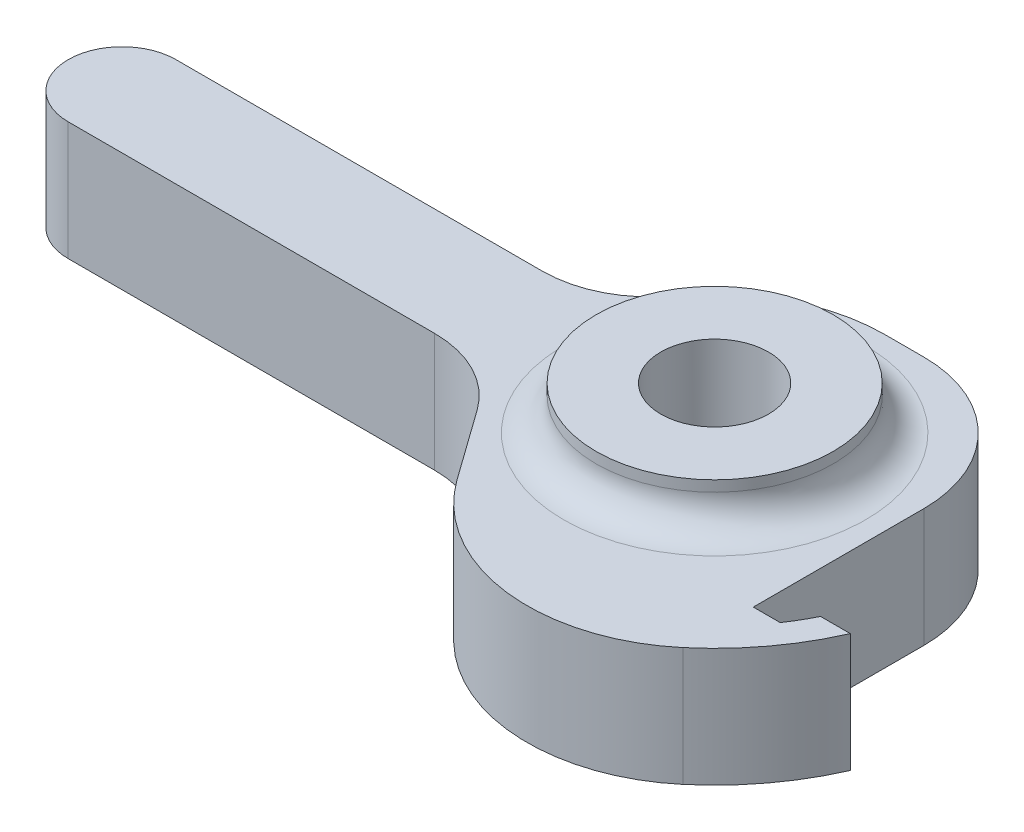
ISO-10303-21;
HEADER;
FILE_DESCRIPTION(('STEP AP214'),'2;1');
FILE_NAME('part.step','',(''),(''),'','','');
FILE_SCHEMA(('AUTOMOTIVE_DESIGN { 1 0 10303 214 1 1 1 1 }'));
ENDSEC;
DATA;
#1=APPLICATION_CONTEXT('core data for automotive mechanical design processes');
#2=APPLICATION_PROTOCOL_DEFINITION('international standard','automotive_design',2000,#1);
#3=PRODUCT_CONTEXT('',#1,'mechanical');
#4=PRODUCT('Part','Part','',(#3));
#5=PRODUCT_RELATED_PRODUCT_CATEGORY('part','',(#4));
#6=PRODUCT_DEFINITION_FORMATION('','',#4);
#7=PRODUCT_DEFINITION_CONTEXT('part definition',#1,'design');
#8=PRODUCT_DEFINITION('design','',#6,#7);
#9=PRODUCT_DEFINITION_SHAPE('','',#8);
#10=(LENGTH_UNIT() NAMED_UNIT(*) SI_UNIT(.MILLI.,.METRE.));
#11=(NAMED_UNIT(*) PLANE_ANGLE_UNIT() SI_UNIT($,.RADIAN.));
#12=(NAMED_UNIT(*) SI_UNIT($,.STERADIAN.) SOLID_ANGLE_UNIT());
#13=UNCERTAINTY_MEASURE_WITH_UNIT(LENGTH_MEASURE(1.E-05),#10,'distance_accuracy_value','');
#14=(GEOMETRIC_REPRESENTATION_CONTEXT(3) GLOBAL_UNCERTAINTY_ASSIGNED_CONTEXT((#13)) GLOBAL_UNIT_ASSIGNED_CONTEXT((#10,
#11,#12)) REPRESENTATION_CONTEXT('',''));
#15=CARTESIAN_POINT('',(0.,0.,0.));
#16=DIRECTION('',(0.,0.,1.));
#17=DIRECTION('',(1.,0.,0.));
#18=AXIS2_PLACEMENT_3D('',#15,#16,#17);
#19=CARTESIAN_POINT('',(82.2518772395423,-78.7336218450221,-13.8106601717798));
#20=DIRECTION('',(0.,1.,0.));
#21=DIRECTION('',(0.,0.,1.));
#22=AXIS2_PLACEMENT_3D('',#19,#20,#21);
#23=PLANE('',#22);
#24=CARTESIAN_POINT('',(80.4412170677624,-78.7336218450221,-12.));
#25=DIRECTION('',(0.,1.,0.));
#26=DIRECTION('',(0.,0.,1.));
#27=AXIS2_PLACEMENT_3D('',#24,#25,#26);
#28=CIRCLE('',#27,6.99999999999999);
#29=CARTESIAN_POINT('',(80.4412170677624,-78.7336218450221,-5.00000000000001));
#30=VERTEX_POINT('',#29);
#31=EDGE_CURVE('E12',#30,#30,#28,.F.);
#32=ORIENTED_EDGE('',*,*,#31,.T.);
#33=EDGE_LOOP('',(#32));
#34=FACE_BOUND('',#33,.T.);
#35=DIRECTION('',(-1.,0.,0.));
#36=VECTOR('',#35,1.);
#37=CARTESIAN_POINT('',(89.5912151460213,-78.7336218450221,-5.89446684));
#38=LINE('',#37,#36);
#39=CARTESIAN_POINT('',(89.5912151460213,-78.7336218450221,-5.89446684));
#40=VERTEX_POINT('',#39);
#41=CARTESIAN_POINT('',(88.3412170677624,-78.7336218450221,-5.89446684));
#42=VERTEX_POINT('',#41);
#43=EDGE_CURVE('E243',#40,#42,#38,.T.);
#44=ORIENTED_EDGE('',*,*,#43,.T.);
#45=DIRECTION('',(0.,0.,-1.));
#46=VECTOR('',#45,1.);
#47=CARTESIAN_POINT('',(88.3412170677624,-78.7336218450221,-13.8106601717798));
#48=LINE('',#47,#46);
#49=CARTESIAN_POINT('',(88.3412170677624,-78.7336218450221,-13.8106601717798));
#50=VERTEX_POINT('',#49);
#51=EDGE_CURVE('E117',#42,#50,#48,.T.);
#52=ORIENTED_EDGE('',*,*,#51,.T.);
#53=CARTESIAN_POINT('',(82.2518772395423,-78.7336218450221,-13.8106601717798));
#54=DIRECTION('',(0.,1.,0.));
#55=DIRECTION('',(0.,0.,1.));
#56=AXIS2_PLACEMENT_3D('',#53,#54,#55);
#57=CIRCLE('',#56,6.08933982822017);
#58=CARTESIAN_POINT('',(82.2518772395423,-78.7336218450221,-19.9));
#59=VERTEX_POINT('',#58);
#60=EDGE_CURVE('E194',#50,#59,#57,.T.);
#61=ORIENTED_EDGE('',*,*,#60,.T.);
#62=DIRECTION('',(-1.,0.,0.));
#63=VECTOR('',#62,1.);
#64=CARTESIAN_POINT('',(82.2518772395423,-78.7336218450221,-19.9));
#65=LINE('',#64,#63);
#66=CARTESIAN_POINT('',(80.4412170677624,-78.7336218450221,-19.9));
#67=VERTEX_POINT('',#66);
#68=EDGE_CURVE('E199',#59,#67,#65,.T.);
#69=ORIENTED_EDGE('',*,*,#68,.T.);
#70=CARTESIAN_POINT('',(80.4412170677624,-78.7336218450221,-12.));
#71=DIRECTION('',(0.,1.,0.));
#72=DIRECTION('',(0.,0.,1.));
#73=AXIS2_PLACEMENT_3D('',#70,#71,#72);
#74=CIRCLE('',#73,7.9);
#75=CARTESIAN_POINT('',(74.0136096301888,-78.7336218450221,-16.593023255814));
#76=VERTEX_POINT('',#75);
#77=EDGE_CURVE('E203',#67,#76,#74,.T.);
#78=ORIENTED_EDGE('',*,*,#77,.T.);
#79=CARTESIAN_POINT('',(69.9455036570409,-78.7336218450221,-19.5));
#80=DIRECTION('',(0.,-1.,0.));
#81=DIRECTION('',(0.,0.,1.));
#82=AXIS2_PLACEMENT_3D('',#79,#80,#81);
#83=CIRCLE('',#82,5.);
#84=CARTESIAN_POINT('',(69.9455036570409,-78.7336218450221,-14.5));
#85=VERTEX_POINT('',#84);
#86=EDGE_CURVE('E207',#76,#85,#83,.T.);
#87=ORIENTED_EDGE('',*,*,#86,.T.);
#88=DIRECTION('',(-1.,0.,0.));
#89=VECTOR('',#88,1.);
#90=CARTESIAN_POINT('',(52.9412170677625,-78.7336218450221,-14.5));
#91=LINE('',#90,#89);
#92=CARTESIAN_POINT('',(52.9412170677625,-78.7336218450221,-14.5));
#93=VERTEX_POINT('',#92);
#94=EDGE_CURVE('E211',#85,#93,#91,.T.);
#95=ORIENTED_EDGE('',*,*,#94,.T.);
#96=CARTESIAN_POINT('',(52.9412170677625,-78.7336218450221,-12.));
#97=DIRECTION('',(0.,1.,0.));
#98=DIRECTION('',(0.,0.,1.));
#99=AXIS2_PLACEMENT_3D('',#96,#97,#98);
#100=CIRCLE('',#99,2.5);
#101=CARTESIAN_POINT('',(52.9412170677625,-78.7336218450221,-9.5));
#102=VERTEX_POINT('',#101);
#103=EDGE_CURVE('E215',#93,#102,#100,.T.);
#104=ORIENTED_EDGE('',*,*,#103,.T.);
#105=DIRECTION('',(1.,0.,0.));
#106=VECTOR('',#105,1.);
#107=CARTESIAN_POINT('',(52.9412170677625,-78.7336218450221,-9.5));
#108=LINE('',#107,#106);
#109=CARTESIAN_POINT('',(69.9455036570409,-78.7336218450221,-9.5));
#110=VERTEX_POINT('',#109);
#111=EDGE_CURVE('E219',#102,#110,#108,.T.);
#112=ORIENTED_EDGE('',*,*,#111,.T.);
#113=CARTESIAN_POINT('',(69.9455036570409,-78.7336218450221,-4.5));
#114=DIRECTION('',(0.,-1.,0.));
#115=DIRECTION('',(0.,0.,-1.));
#116=AXIS2_PLACEMENT_3D('',#113,#114,#115);
#117=CIRCLE('',#116,5.);
#118=CARTESIAN_POINT('',(74.0136096301888,-78.7336218450221,-7.40697674418605));
#119=VERTEX_POINT('',#118);
#120=EDGE_CURVE('E223',#110,#119,#117,.T.);
#121=ORIENTED_EDGE('',*,*,#120,.T.);
#122=DIRECTION('',(0.581395348837209,0.,0.813621194629577));
#123=VECTOR('',#122,1.);
#124=CARTESIAN_POINT('',(74.0136096301888,-78.7336218450221,-7.40697674418604));
#125=LINE('',#124,#123);
#126=CARTESIAN_POINT('',(76.3469888080829,-78.7336218450221,-4.14157952688972));
#127=VERTEX_POINT('',#126);
#128=EDGE_CURVE('E227',#119,#127,#125,.T.);
#129=ORIENTED_EDGE('',*,*,#128,.T.);
#130=CARTESIAN_POINT('',(83.0378562538661,-78.7336218450221,-8.92272244492256));
#131=DIRECTION('',(0.,1.,0.));
#132=DIRECTION('',(0.,0.,-1.));
#133=AXIS2_PLACEMENT_3D('',#130,#131,#132);
#134=CIRCLE('',#133,8.22356581901648);
#135=CARTESIAN_POINT('',(88.3412170677624,-78.7336218450221,-2.63770861380611));
#136=VERTEX_POINT('',#135);
#137=EDGE_CURVE('E231',#127,#136,#134,.T.);
#138=ORIENTED_EDGE('',*,*,#137,.T.);
#139=CARTESIAN_POINT('',(80.4412170677624,-78.7336218450221,-12.));
#140=DIRECTION('',(0.,1.,0.));
#141=DIRECTION('',(0.,0.,-1.));
#142=AXIS2_PLACEMENT_3D('',#139,#140,#141);
#143=CIRCLE('',#142,12.25);
#144=CARTESIAN_POINT('',(91.6588423673576,-78.7336218450221,-7.07786808));
#145=VERTEX_POINT('',#144);
#146=EDGE_CURVE('E235',#136,#145,#143,.T.);
#147=ORIENTED_EDGE('',*,*,#146,.T.);
#148=DIRECTION('',(-1.,0.,0.));
#149=VECTOR('',#148,1.);
#150=CARTESIAN_POINT('',(91.6588423673576,-78.7336218450221,-7.07786808));
#151=LINE('',#150,#149);
#152=CARTESIAN_POINT('',(90.2785244921605,-78.7336218450221,-7.07786808));
#153=VERTEX_POINT('',#152);
#154=EDGE_CURVE('E239',#145,#153,#151,.T.);
#155=ORIENTED_EDGE('',*,*,#154,.T.);
#156=CARTESIAN_POINT('',(80.4412170677624,-78.7336218450221,-12.));
#157=DIRECTION('',(0.,-1.,0.));
#158=DIRECTION('',(0.,0.,-1.));
#159=AXIS2_PLACEMENT_3D('',#156,#157,#158);
#160=CIRCLE('',#159,11.);
#161=EDGE_CURVE('E160',#153,#40,#160,.T.);
#162=ORIENTED_EDGE('',*,*,#161,.T.);
#163=EDGE_LOOP('',(#44,#52,#61,#69,#78,#87,#95,#104,#112,#121,#129,#138,#147,#155,#162));
#164=FACE_BOUND('',#163,.T.);
#165=ADVANCED_FACE('F45',(#34,#164),#23,.T.);
#166=CARTESIAN_POINT('',(89.5912151460213,-84.2336218450221,-5.89446684));
#167=DIRECTION('',(0.,0.,-1.));
#168=DIRECTION('',(-1.,0.,0.));
#169=AXIS2_PLACEMENT_3D('',#166,#167,#168);
#170=PLANE('',#169);
#171=ORIENTED_EDGE('',*,*,#43,.F.);
#172=DIRECTION('',(0.,1.,0.));
#173=VECTOR('',#172,1.);
#174=CARTESIAN_POINT('',(89.5912151460213,-84.2336218450221,-5.89446684));
#175=LINE('',#174,#173);
#176=CARTESIAN_POINT('',(89.5912151460213,-84.2336218450221,-5.89446684));
#177=VERTEX_POINT('',#176);
#178=EDGE_CURVE('E113',#177,#40,#175,.T.);
#179=ORIENTED_EDGE('',*,*,#178,.F.);
#180=DIRECTION('',(-1.,0.,0.));
#181=VECTOR('',#180,1.);
#182=CARTESIAN_POINT('',(89.5912151460213,-84.2336218450221,-5.89446684));
#183=LINE('',#182,#181);
#184=CARTESIAN_POINT('',(88.3412170677624,-84.2336218450221,-5.89446684));
#185=VERTEX_POINT('',#184);
#186=EDGE_CURVE('E175',#177,#185,#183,.T.);
#187=ORIENTED_EDGE('',*,*,#186,.T.);
#188=DIRECTION('',(0.,1.,0.));
#189=VECTOR('',#188,1.);
#190=CARTESIAN_POINT('',(88.3412170677624,-84.2336218450221,-5.89446684));
#191=LINE('',#190,#189);
#192=EDGE_CURVE('E63',#185,#42,#191,.T.);
#193=ORIENTED_EDGE('',*,*,#192,.T.);
#194=EDGE_LOOP('',(#171,#179,#187,#193));
#195=FACE_BOUND('',#194,.T.);
#196=ADVANCED_FACE('F303',(#195),#170,.T.);
#197=CARTESIAN_POINT('',(80.4412170677624,-84.2336218450221,-12.));
#198=DIRECTION('',(0.,1.,0.));
#199=DIRECTION('',(0.,0.,1.));
#200=AXIS2_PLACEMENT_3D('',#197,#198,#199);
#201=CYLINDRICAL_SURFACE('',#200,11.);
#202=ORIENTED_EDGE('',*,*,#161,.F.);
#203=DIRECTION('',(0.,1.,0.));
#204=VECTOR('',#203,1.);
#205=CARTESIAN_POINT('',(90.2785244921605,-84.2336218450221,-7.07786808));
#206=LINE('',#205,#204);
#207=CARTESIAN_POINT('',(90.2785244921605,-84.2336218450221,-7.07786808));
#208=VERTEX_POINT('',#207);
#209=EDGE_CURVE('E155',#208,#153,#206,.T.);
#210=ORIENTED_EDGE('',*,*,#209,.F.);
#211=CARTESIAN_POINT('',(80.4412170677624,-84.2336218450221,-12.));
#212=DIRECTION('',(0.,-1.,0.));
#213=DIRECTION('',(0.,0.,-1.));
#214=AXIS2_PLACEMENT_3D('',#211,#212,#213);
#215=CIRCLE('',#214,11.);
#216=EDGE_CURVE('E158',#208,#177,#215,.T.);
#217=ORIENTED_EDGE('',*,*,#216,.T.);
#218=ORIENTED_EDGE('',*,*,#178,.T.);
#219=EDGE_LOOP('',(#202,#210,#217,#218));
#220=FACE_BOUND('',#219,.T.);
#221=ADVANCED_FACE('F157',(#220),#201,.F.);
#222=CARTESIAN_POINT('',(91.6588423673576,-84.2336218450221,-7.07786808));
#223=DIRECTION('',(0.,0.,-1.));
#224=DIRECTION('',(-1.,0.,0.));
#225=AXIS2_PLACEMENT_3D('',#222,#223,#224);
#226=PLANE('',#225);
#227=ORIENTED_EDGE('',*,*,#154,.F.);
#228=DIRECTION('',(0.,1.,0.));
#229=VECTOR('',#228,1.);
#230=CARTESIAN_POINT('',(91.6588423673576,-84.2336218450221,-7.07786808));
#231=LINE('',#230,#229);
#232=CARTESIAN_POINT('',(91.6588423673576,-84.2336218450221,-7.07786808));
#233=VERTEX_POINT('',#232);
#234=EDGE_CURVE('E166',#233,#145,#231,.T.);
#235=ORIENTED_EDGE('',*,*,#234,.F.);
#236=DIRECTION('',(-1.,0.,0.));
#237=VECTOR('',#236,1.);
#238=CARTESIAN_POINT('',(91.6588423673576,-84.2336218450221,-7.07786808));
#239=LINE('',#238,#237);
#240=EDGE_CURVE('E172',#233,#208,#239,.T.);
#241=ORIENTED_EDGE('',*,*,#240,.T.);
#242=ORIENTED_EDGE('',*,*,#209,.T.);
#243=EDGE_LOOP('',(#227,#235,#241,#242));
#244=FACE_BOUND('',#243,.T.);
#245=ADVANCED_FACE('F178',(#244),#226,.T.);
#246=CARTESIAN_POINT('',(80.4412170677624,-84.2336218450221,-12.));
#247=DIRECTION('',(0.,1.,0.));
#248=DIRECTION('',(0.,0.,1.));
#249=AXIS2_PLACEMENT_3D('',#246,#247,#248);
#250=CYLINDRICAL_SURFACE('',#249,12.25);
#251=ORIENTED_EDGE('',*,*,#146,.F.);
#252=DIRECTION('',(0.,1.,0.));
#253=VECTOR('',#252,1.);
#254=CARTESIAN_POINT('',(88.3412170677624,-84.2336218450221,-2.63770861380611));
#255=LINE('',#254,#253);
#256=CARTESIAN_POINT('',(88.3412170677624,-84.2336218450221,-2.63770861380611));
#257=VERTEX_POINT('',#256);
#258=EDGE_CURVE('E253',#257,#136,#255,.T.);
#259=ORIENTED_EDGE('',*,*,#258,.F.);
#260=CARTESIAN_POINT('',(80.4412170677624,-84.2336218450221,-12.));
#261=DIRECTION('',(0.,1.,0.));
#262=DIRECTION('',(0.,0.,-1.));
#263=AXIS2_PLACEMENT_3D('',#260,#261,#262);
#264=CIRCLE('',#263,12.25);
#265=EDGE_CURVE('E180',#257,#233,#264,.T.);
#266=ORIENTED_EDGE('',*,*,#265,.T.);
#267=ORIENTED_EDGE('',*,*,#234,.T.);
#268=EDGE_LOOP('',(#251,#259,#266,#267));
#269=FACE_BOUND('',#268,.T.);
#270=ADVANCED_FACE('F319',(#269),#250,.T.);
#271=CARTESIAN_POINT('',(83.0378562538661,-84.2336218450221,-8.92272244492256));
#272=DIRECTION('',(0.,1.,0.));
#273=DIRECTION('',(0.,0.,1.));
#274=AXIS2_PLACEMENT_3D('',#271,#272,#273);
#275=CYLINDRICAL_SURFACE('',#274,8.22356581901648);
#276=ORIENTED_EDGE('',*,*,#137,.F.);
#277=DIRECTION('',(0.,1.,0.));
#278=VECTOR('',#277,1.);
#279=CARTESIAN_POINT('',(76.3469888080829,-84.2336218450221,-4.14157952688972));
#280=LINE('',#279,#278);
#281=CARTESIAN_POINT('',(76.3469888080829,-84.2336218450221,-4.14157952688972));
#282=VERTEX_POINT('',#281);
#283=EDGE_CURVE('E256',#282,#127,#280,.T.);
#284=ORIENTED_EDGE('',*,*,#283,.F.);
#285=CARTESIAN_POINT('',(83.0378562538661,-84.2336218450221,-8.92272244492256));
#286=DIRECTION('',(0.,1.,0.));
#287=DIRECTION('',(0.,0.,-1.));
#288=AXIS2_PLACEMENT_3D('',#285,#286,#287);
#289=CIRCLE('',#288,8.22356581901648);
#290=EDGE_CURVE('E185',#282,#257,#289,.T.);
#291=ORIENTED_EDGE('',*,*,#290,.T.);
#292=ORIENTED_EDGE('',*,*,#258,.T.);
#293=EDGE_LOOP('',(#276,#284,#291,#292));
#294=FACE_BOUND('',#293,.T.);
#295=ADVANCED_FACE('F322',(#294),#275,.T.);
#296=CARTESIAN_POINT('',(74.0136096301888,-84.2336218450221,-7.40697674418604));
#297=DIRECTION('',(-0.813621194629577,0.,0.581395348837209));
#298=DIRECTION('',(0.581395348837209,0.,0.813621194629577));
#299=AXIS2_PLACEMENT_3D('',#296,#297,#298);
#300=PLANE('',#299);
#301=ORIENTED_EDGE('',*,*,#128,.F.);
#302=DIRECTION('',(0.,1.,0.));
#303=VECTOR('',#302,1.);
#304=CARTESIAN_POINT('',(74.0136096301888,-84.2336218450221,-7.40697674418605));
#305=LINE('',#304,#303);
#306=CARTESIAN_POINT('',(74.0136096301888,-84.2336218450221,-7.40697674418605));
#307=VERTEX_POINT('',#306);
#308=EDGE_CURVE('E259',#307,#119,#305,.T.);
#309=ORIENTED_EDGE('',*,*,#308,.F.);
#310=DIRECTION('',(0.581395348837209,0.,0.813621194629577));
#311=VECTOR('',#310,1.);
#312=CARTESIAN_POINT('',(74.0136096301888,-84.2336218450221,-7.40697674418604));
#313=LINE('',#312,#311);
#314=EDGE_CURVE('E417',#307,#282,#313,.T.);
#315=ORIENTED_EDGE('',*,*,#314,.T.);
#316=ORIENTED_EDGE('',*,*,#283,.T.);
#317=EDGE_LOOP('',(#301,#309,#315,#316));
#318=FACE_BOUND('',#317,.T.);
#319=ADVANCED_FACE('F326',(#318),#300,.T.);
#320=CARTESIAN_POINT('',(69.9455036570409,-84.2336218450221,-4.5));
#321=DIRECTION('',(0.,1.,0.));
#322=DIRECTION('',(0.,0.,1.));
#323=AXIS2_PLACEMENT_3D('',#320,#321,#322);
#324=CYLINDRICAL_SURFACE('',#323,5.);
#325=ORIENTED_EDGE('',*,*,#120,.F.);
#326=DIRECTION('',(0.,1.,0.));
#327=VECTOR('',#326,1.);
#328=CARTESIAN_POINT('',(69.9455036570409,-84.2336218450221,-9.5));
#329=LINE('',#328,#327);
#330=CARTESIAN_POINT('',(69.9455036570409,-84.2336218450221,-9.5));
#331=VERTEX_POINT('',#330);
#332=EDGE_CURVE('E262',#331,#110,#329,.T.);
#333=ORIENTED_EDGE('',*,*,#332,.F.);
#334=CARTESIAN_POINT('',(69.9455036570409,-84.2336218450221,-4.5));
#335=DIRECTION('',(0.,-1.,0.));
#336=DIRECTION('',(0.,0.,-1.));
#337=AXIS2_PLACEMENT_3D('',#334,#335,#336);
#338=CIRCLE('',#337,5.);
#339=EDGE_CURVE('E413',#331,#307,#338,.T.);
#340=ORIENTED_EDGE('',*,*,#339,.T.);
#341=ORIENTED_EDGE('',*,*,#308,.T.);
#342=EDGE_LOOP('',(#325,#333,#340,#341));
#343=FACE_BOUND('',#342,.T.);
#344=ADVANCED_FACE('F330',(#343),#324,.F.);
#345=CARTESIAN_POINT('',(52.9412170677625,-84.2336218450221,-9.5));
#346=DIRECTION('',(0.,0.,1.));
#347=DIRECTION('',(1.,0.,0.));
#348=AXIS2_PLACEMENT_3D('',#345,#346,#347);
#349=PLANE('',#348);
#350=ORIENTED_EDGE('',*,*,#111,.F.);
#351=DIRECTION('',(0.,1.,0.));
#352=VECTOR('',#351,1.);
#353=CARTESIAN_POINT('',(52.9412170677625,-84.2336218450221,-9.5));
#354=LINE('',#353,#352);
#355=CARTESIAN_POINT('',(52.9412170677625,-84.2336218450221,-9.5));
#356=VERTEX_POINT('',#355);
#357=EDGE_CURVE('E265',#356,#102,#354,.T.);
#358=ORIENTED_EDGE('',*,*,#357,.F.);
#359=DIRECTION('',(1.,0.,0.));
#360=VECTOR('',#359,1.);
#361=CARTESIAN_POINT('',(52.9412170677625,-84.2336218450221,-9.5));
#362=LINE('',#361,#360);
#363=EDGE_CURVE('E409',#356,#331,#362,.T.);
#364=ORIENTED_EDGE('',*,*,#363,.T.);
#365=ORIENTED_EDGE('',*,*,#332,.T.);
#366=EDGE_LOOP('',(#350,#358,#364,#365));
#367=FACE_BOUND('',#366,.T.);
#368=ADVANCED_FACE('F334',(#367),#349,.T.);
#369=CARTESIAN_POINT('',(52.9412170677625,-84.2336218450221,-12.));
#370=DIRECTION('',(0.,1.,0.));
#371=DIRECTION('',(0.,0.,1.));
#372=AXIS2_PLACEMENT_3D('',#369,#370,#371);
#373=CYLINDRICAL_SURFACE('',#372,2.5);
#374=ORIENTED_EDGE('',*,*,#103,.F.);
#375=DIRECTION('',(0.,1.,0.));
#376=VECTOR('',#375,1.);
#377=CARTESIAN_POINT('',(52.9412170677625,-84.2336218450221,-14.5));
#378=LINE('',#377,#376);
#379=CARTESIAN_POINT('',(52.9412170677625,-84.2336218450221,-14.5));
#380=VERTEX_POINT('',#379);
#381=EDGE_CURVE('E268',#380,#93,#378,.T.);
#382=ORIENTED_EDGE('',*,*,#381,.F.);
#383=CARTESIAN_POINT('',(52.9412170677625,-84.2336218450221,-12.));
#384=DIRECTION('',(0.,1.,0.));
#385=DIRECTION('',(0.,0.,1.));
#386=AXIS2_PLACEMENT_3D('',#383,#384,#385);
#387=CIRCLE('',#386,2.5);
#388=EDGE_CURVE('E406',#380,#356,#387,.T.);
#389=ORIENTED_EDGE('',*,*,#388,.T.);
#390=ORIENTED_EDGE('',*,*,#357,.T.);
#391=EDGE_LOOP('',(#374,#382,#389,#390));
#392=FACE_BOUND('',#391,.T.);
#393=ADVANCED_FACE('F338',(#392),#373,.T.);
#394=CARTESIAN_POINT('',(52.9412170677625,-84.2336218450221,-14.5));
#395=DIRECTION('',(0.,0.,-1.));
#396=DIRECTION('',(-1.,0.,0.));
#397=AXIS2_PLACEMENT_3D('',#394,#395,#396);
#398=PLANE('',#397);
#399=ORIENTED_EDGE('',*,*,#94,.F.);
#400=DIRECTION('',(0.,1.,0.));
#401=VECTOR('',#400,1.);
#402=CARTESIAN_POINT('',(69.9455036570409,-84.2336218450221,-14.5));
#403=LINE('',#402,#401);
#404=CARTESIAN_POINT('',(69.9455036570409,-84.2336218450221,-14.5));
#405=VERTEX_POINT('',#404);
#406=EDGE_CURVE('E271',#405,#85,#403,.T.);
#407=ORIENTED_EDGE('',*,*,#406,.F.);
#408=DIRECTION('',(-1.,0.,0.));
#409=VECTOR('',#408,1.);
#410=CARTESIAN_POINT('',(52.9412170677625,-84.2336218450221,-14.5));
#411=LINE('',#410,#409);
#412=EDGE_CURVE('E402',#405,#380,#411,.T.);
#413=ORIENTED_EDGE('',*,*,#412,.T.);
#414=ORIENTED_EDGE('',*,*,#381,.T.);
#415=EDGE_LOOP('',(#399,#407,#413,#414));
#416=FACE_BOUND('',#415,.T.);
#417=ADVANCED_FACE('F342',(#416),#398,.T.);
#418=CARTESIAN_POINT('',(69.9455036570409,-84.2336218450221,-19.5));
#419=DIRECTION('',(0.,1.,0.));
#420=DIRECTION('',(0.,0.,1.));
#421=AXIS2_PLACEMENT_3D('',#418,#419,#420);
#422=CYLINDRICAL_SURFACE('',#421,5.);
#423=ORIENTED_EDGE('',*,*,#86,.F.);
#424=DIRECTION('',(0.,1.,0.));
#425=VECTOR('',#424,1.);
#426=CARTESIAN_POINT('',(74.0136096301888,-84.2336218450221,-16.593023255814));
#427=LINE('',#426,#425);
#428=CARTESIAN_POINT('',(74.0136096301888,-84.2336218450221,-16.593023255814));
#429=VERTEX_POINT('',#428);
#430=EDGE_CURVE('E274',#429,#76,#427,.T.);
#431=ORIENTED_EDGE('',*,*,#430,.F.);
#432=CARTESIAN_POINT('',(69.9455036570409,-84.2336218450221,-19.5));
#433=DIRECTION('',(0.,-1.,0.));
#434=DIRECTION('',(0.,0.,1.));
#435=AXIS2_PLACEMENT_3D('',#432,#433,#434);
#436=CIRCLE('',#435,5.);
#437=EDGE_CURVE('E398',#429,#405,#436,.T.);
#438=ORIENTED_EDGE('',*,*,#437,.T.);
#439=ORIENTED_EDGE('',*,*,#406,.T.);
#440=EDGE_LOOP('',(#423,#431,#438,#439));
#441=FACE_BOUND('',#440,.T.);
#442=ADVANCED_FACE('F346',(#441),#422,.F.);
#443=CARTESIAN_POINT('',(80.4412170677624,-84.2336218450221,-12.));
#444=DIRECTION('',(0.,1.,0.));
#445=DIRECTION('',(0.,0.,1.));
#446=AXIS2_PLACEMENT_3D('',#443,#444,#445);
#447=CYLINDRICAL_SURFACE('',#446,7.9);
#448=ORIENTED_EDGE('',*,*,#77,.F.);
#449=DIRECTION('',(0.,1.,0.));
#450=VECTOR('',#449,1.);
#451=CARTESIAN_POINT('',(80.4412170677624,-84.2336218450221,-19.9));
#452=LINE('',#451,#450);
#453=CARTESIAN_POINT('',(80.4412170677624,-84.2336218450221,-19.9));
#454=VERTEX_POINT('',#453);
#455=EDGE_CURVE('E277',#454,#67,#452,.T.);
#456=ORIENTED_EDGE('',*,*,#455,.F.);
#457=CARTESIAN_POINT('',(80.4412170677624,-84.2336218450221,-12.));
#458=DIRECTION('',(0.,1.,0.));
#459=DIRECTION('',(0.,0.,1.));
#460=AXIS2_PLACEMENT_3D('',#457,#458,#459);
#461=CIRCLE('',#460,7.9);
#462=EDGE_CURVE('E394',#454,#429,#461,.T.);
#463=ORIENTED_EDGE('',*,*,#462,.T.);
#464=ORIENTED_EDGE('',*,*,#430,.T.);
#465=EDGE_LOOP('',(#448,#456,#463,#464));
#466=FACE_BOUND('',#465,.T.);
#467=ADVANCED_FACE('F350',(#466),#447,.T.);
#468=CARTESIAN_POINT('',(82.2518772395423,-84.2336218450221,-19.9));
#469=DIRECTION('',(0.,0.,-1.));
#470=DIRECTION('',(-1.,0.,0.));
#471=AXIS2_PLACEMENT_3D('',#468,#469,#470);
#472=PLANE('',#471);
#473=ORIENTED_EDGE('',*,*,#68,.F.);
#474=DIRECTION('',(0.,1.,0.));
#475=VECTOR('',#474,1.);
#476=CARTESIAN_POINT('',(82.2518772395423,-84.2336218450221,-19.9));
#477=LINE('',#476,#475);
#478=CARTESIAN_POINT('',(82.2518772395423,-84.2336218450221,-19.9));
#479=VERTEX_POINT('',#478);
#480=EDGE_CURVE('E280',#479,#59,#477,.T.);
#481=ORIENTED_EDGE('',*,*,#480,.F.);
#482=DIRECTION('',(-1.,0.,0.));
#483=VECTOR('',#482,1.);
#484=CARTESIAN_POINT('',(82.2518772395423,-84.2336218450221,-19.9));
#485=LINE('',#484,#483);
#486=EDGE_CURVE('E390',#479,#454,#485,.T.);
#487=ORIENTED_EDGE('',*,*,#486,.T.);
#488=ORIENTED_EDGE('',*,*,#455,.T.);
#489=EDGE_LOOP('',(#473,#481,#487,#488));
#490=FACE_BOUND('',#489,.T.);
#491=ADVANCED_FACE('F354',(#490),#472,.T.);
#492=CARTESIAN_POINT('',(82.2518772395423,-84.2336218450221,-13.8106601717798));
#493=DIRECTION('',(0.,1.,0.));
#494=DIRECTION('',(0.,0.,1.));
#495=AXIS2_PLACEMENT_3D('',#492,#493,#494);
#496=CYLINDRICAL_SURFACE('',#495,6.08933982822017);
#497=ORIENTED_EDGE('',*,*,#60,.F.);
#498=DIRECTION('',(0.,1.,0.));
#499=VECTOR('',#498,1.);
#500=CARTESIAN_POINT('',(88.3412170677624,-84.2336218450221,-13.8106601717798));
#501=LINE('',#500,#499);
#502=CARTESIAN_POINT('',(88.3412170677624,-84.2336218450221,-13.8106601717798));
#503=VERTEX_POINT('',#502);
#504=EDGE_CURVE('E191',#503,#50,#501,.T.);
#505=ORIENTED_EDGE('',*,*,#504,.F.);
#506=CARTESIAN_POINT('',(82.2518772395423,-84.2336218450221,-13.8106601717798));
#507=DIRECTION('',(0.,1.,0.));
#508=DIRECTION('',(0.,0.,1.));
#509=AXIS2_PLACEMENT_3D('',#506,#507,#508);
#510=CIRCLE('',#509,6.08933982822017);
#511=EDGE_CURVE('E386',#503,#479,#510,.T.);
#512=ORIENTED_EDGE('',*,*,#511,.T.);
#513=ORIENTED_EDGE('',*,*,#480,.T.);
#514=EDGE_LOOP('',(#497,#505,#512,#513));
#515=FACE_BOUND('',#514,.T.);
#516=ADVANCED_FACE('F358',(#515),#496,.T.);
#517=CARTESIAN_POINT('',(88.3412170677624,-84.2336218450221,-13.8106601717798));
#518=DIRECTION('',(1.,0.,0.));
#519=DIRECTION('',(0.,0.,-1.));
#520=AXIS2_PLACEMENT_3D('',#517,#518,#519);
#521=PLANE('',#520);
#522=ORIENTED_EDGE('',*,*,#51,.F.);
#523=ORIENTED_EDGE('',*,*,#192,.F.);
#524=DIRECTION('',(0.,0.,-1.));
#525=VECTOR('',#524,1.);
#526=CARTESIAN_POINT('',(88.3412170677624,-84.2336218450221,-5.89446684));
#527=LINE('',#526,#525);
#528=EDGE_CURVE('E120',#185,#503,#527,.T.);
#529=ORIENTED_EDGE('',*,*,#528,.T.);
#530=ORIENTED_EDGE('',*,*,#504,.T.);
#531=EDGE_LOOP('',(#522,#523,#529,#530));
#532=FACE_BOUND('',#531,.T.);
#533=ADVANCED_FACE('F361',(#532),#521,.T.);
#534=CARTESIAN_POINT('',(82.2518772395423,-84.2336218450221,-13.8106601717798));
#535=DIRECTION('',(0.,1.,0.));
#536=DIRECTION('',(0.,0.,1.));
#537=AXIS2_PLACEMENT_3D('',#534,#535,#536);
#538=PLANE('',#537);
#539=CARTESIAN_POINT('',(80.4412170677624,-84.2336218450221,-12.));
#540=DIRECTION('',(0.,1.,0.));
#541=DIRECTION('',(0.,0.,1.));
#542=AXIS2_PLACEMENT_3D('',#539,#540,#541);
#543=CIRCLE('',#542,2.49999999999999);
#544=CARTESIAN_POINT('',(80.4412170677624,-84.2336218450221,-9.50000000000001));
#545=VERTEX_POINT('',#544);
#546=EDGE_CURVE('E195',#545,#545,#543,.T.);
#547=ORIENTED_EDGE('',*,*,#546,.T.);
#548=EDGE_LOOP('',(#547));
#549=FACE_BOUND('',#548,.T.);
#550=ORIENTED_EDGE('',*,*,#528,.F.);
#551=ORIENTED_EDGE('',*,*,#186,.F.);
#552=ORIENTED_EDGE('',*,*,#216,.F.);
#553=ORIENTED_EDGE('',*,*,#240,.F.);
#554=ORIENTED_EDGE('',*,*,#265,.F.);
#555=ORIENTED_EDGE('',*,*,#290,.F.);
#556=ORIENTED_EDGE('',*,*,#314,.F.);
#557=ORIENTED_EDGE('',*,*,#339,.F.);
#558=ORIENTED_EDGE('',*,*,#363,.F.);
#559=ORIENTED_EDGE('',*,*,#388,.F.);
#560=ORIENTED_EDGE('',*,*,#412,.F.);
#561=ORIENTED_EDGE('',*,*,#437,.F.);
#562=ORIENTED_EDGE('',*,*,#462,.F.);
#563=ORIENTED_EDGE('',*,*,#486,.F.);
#564=ORIENTED_EDGE('',*,*,#511,.F.);
#565=EDGE_LOOP('',(#550,#551,#552,#553,#554,#555,#556,#557,#558,#559,#560,#561,#562,#563,#564));
#566=FACE_BOUND('',#565,.T.);
#567=ADVANCED_FACE('F170',(#549,#566),#538,.F.);
#568=CARTESIAN_POINT('',(80.4412170677624,-84.2336218450221,-12.));
#569=DIRECTION('',(0.,1.,0.));
#570=DIRECTION('',(0.,0.,1.));
#571=AXIS2_PLACEMENT_3D('',#568,#569,#570);
#572=CYLINDRICAL_SURFACE('',#571,2.49999999999999);
#573=ORIENTED_EDGE('',*,*,#546,.F.);
#574=EDGE_LOOP('',(#573));
#575=FACE_BOUND('',#574,.T.);
#576=CARTESIAN_POINT('',(80.4412170677624,-76.7336218450221,-12.));
#577=DIRECTION('',(0.,-1.,0.));
#578=DIRECTION('',(0.,0.,-1.));
#579=AXIS2_PLACEMENT_3D('',#576,#577,#578);
#580=CIRCLE('',#579,2.49999999999999);
#581=CARTESIAN_POINT('',(80.4412170677624,-76.7336218450221,-14.5));
#582=VERTEX_POINT('',#581);
#583=EDGE_CURVE('E375',#582,#582,#580,.T.);
#584=ORIENTED_EDGE('',*,*,#583,.F.);
#585=EDGE_LOOP('',(#584));
#586=FACE_BOUND('',#585,.T.);
#587=ADVANCED_FACE('F297',(#575,#586),#572,.F.);
#588=CARTESIAN_POINT('',(80.4412170677624,-76.7336218450221,-12.));
#589=DIRECTION('',(0.,-1.,0.));
#590=DIRECTION('',(0.,0.,-1.));
#591=AXIS2_PLACEMENT_3D('',#588,#589,#590);
#592=PLANE('',#591);
#593=ORIENTED_EDGE('',*,*,#583,.T.);
#594=EDGE_LOOP('',(#593));
#595=FACE_BOUND('',#594,.T.);
#596=CARTESIAN_POINT('',(80.4412170677624,-76.7336218450221,-12.));
#597=DIRECTION('',(0.,-1.,0.));
#598=DIRECTION('',(0.,0.,-1.));
#599=AXIS2_PLACEMENT_3D('',#596,#597,#598);
#600=CIRCLE('',#599,5.49999999999999);
#601=CARTESIAN_POINT('',(80.4412170677624,-76.7336218450221,-17.5));
#602=VERTEX_POINT('',#601);
#603=EDGE_CURVE('E380',#602,#602,#600,.T.);
#604=ORIENTED_EDGE('',*,*,#603,.F.);
#605=EDGE_LOOP('',(#604));
#606=FACE_BOUND('',#605,.T.);
#607=ADVANCED_FACE('F292',(#595,#606),#592,.F.);
#608=CARTESIAN_POINT('',(80.4412170677624,-84.2356218450221,-12.));
#609=DIRECTION('',(0.,1.,0.));
#610=DIRECTION('',(0.,0.,1.));
#611=AXIS2_PLACEMENT_3D('',#608,#609,#610);
#612=CYLINDRICAL_SURFACE('',#611,5.49999999999999);
#613=CARTESIAN_POINT('',(80.4412170677624,-77.2336218450221,-12.));
#614=DIRECTION('',(0.,1.,0.));
#615=DIRECTION('',(0.,0.,1.));
#616=AXIS2_PLACEMENT_3D('',#613,#614,#615);
#617=CIRCLE('',#616,5.49999999999999);
#618=CARTESIAN_POINT('',(80.4412170677624,-77.2336218450221,-6.50000000000001));
#619=VERTEX_POINT('',#618);
#620=EDGE_CURVE('E55',#619,#619,#617,.T.);
#621=ORIENTED_EDGE('',*,*,#620,.T.);
#622=EDGE_LOOP('',(#621));
#623=FACE_BOUND('',#622,.T.);
#624=ORIENTED_EDGE('',*,*,#603,.T.);
#625=EDGE_LOOP('',(#624));
#626=FACE_BOUND('',#625,.T.);
#627=ADVANCED_FACE('F287',(#623,#626),#612,.T.);
#628=CARTESIAN_POINT('',(80.4412170677624,-77.2336218450221,-12.));
#629=DIRECTION('',(0.,1.,0.));
#630=DIRECTION('',(0.,0.,1.));
#631=AXIS2_PLACEMENT_3D('',#628,#629,#630);
#632=TOROIDAL_SURFACE('',#631,6.99999999999999,1.5);
#633=ORIENTED_EDGE('',*,*,#31,.F.);
#634=EDGE_LOOP('',(#633));
#635=FACE_BOUND('',#634,.T.);
#636=ORIENTED_EDGE('',*,*,#620,.F.);
#637=EDGE_LOOP('',(#636));
#638=FACE_BOUND('',#637,.T.);
#639=ADVANCED_FACE('F47',(#635,#638),#632,.F.);
#640=CLOSED_SHELL('',(#165,#196,#221,#245,#270,#295,#319,#344,#368,#393,#417,#442,#467,#491,
#516,#533,#567,#587,#607,#627,#639));
#641=MANIFOLD_SOLID_BREP('B2',#640);
#642=ADVANCED_BREP_SHAPE_REPRESENTATION('',(#18,#641),#14);
#643=SHAPE_DEFINITION_REPRESENTATION(#9,#642);
ENDSEC;
END-ISO-10303-21;
